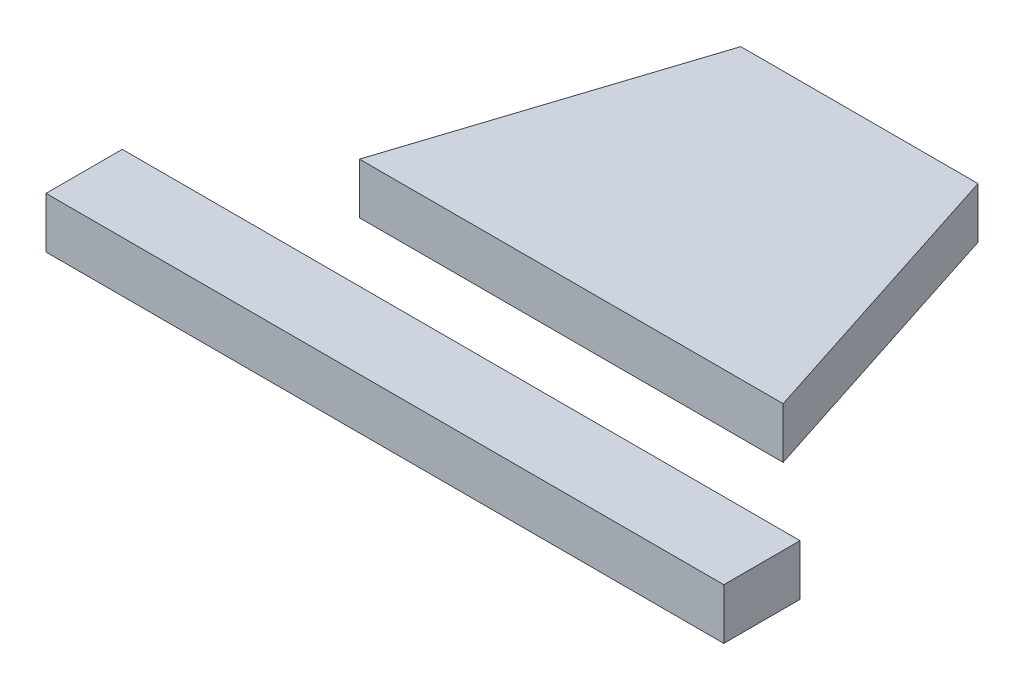
ISO-10303-21;
HEADER;
FILE_DESCRIPTION(('STEP AP214'),'2;1');
FILE_NAME('part.step','',(''),(''),'','','');
FILE_SCHEMA(('AUTOMOTIVE_DESIGN { 1 0 10303 214 1 1 1 1 }'));
ENDSEC;
DATA;
#1=APPLICATION_CONTEXT('core data for automotive mechanical design processes');
#2=APPLICATION_PROTOCOL_DEFINITION('international standard','automotive_design',2000,#1);
#3=PRODUCT_CONTEXT('',#1,'mechanical');
#4=PRODUCT('Part','Part','',(#3));
#5=PRODUCT_RELATED_PRODUCT_CATEGORY('part','',(#4));
#6=PRODUCT_DEFINITION_FORMATION('','',#4);
#7=PRODUCT_DEFINITION_CONTEXT('part definition',#1,'design');
#8=PRODUCT_DEFINITION('design','',#6,#7);
#9=PRODUCT_DEFINITION_SHAPE('','',#8);
#10=(LENGTH_UNIT() NAMED_UNIT(*) SI_UNIT(.MILLI.,.METRE.));
#11=(NAMED_UNIT(*) PLANE_ANGLE_UNIT() SI_UNIT($,.RADIAN.));
#12=(NAMED_UNIT(*) SI_UNIT($,.STERADIAN.) SOLID_ANGLE_UNIT());
#13=UNCERTAINTY_MEASURE_WITH_UNIT(LENGTH_MEASURE(1.E-05),#10,'distance_accuracy_value','');
#14=(GEOMETRIC_REPRESENTATION_CONTEXT(3) GLOBAL_UNCERTAINTY_ASSIGNED_CONTEXT((#13)) GLOBAL_UNIT_ASSIGNED_CONTEXT((#10,
#11,#12)) REPRESENTATION_CONTEXT('',''));
#15=CARTESIAN_POINT('',(0.,0.,0.));
#16=DIRECTION('',(0.,0.,1.));
#17=DIRECTION('',(1.,0.,0.));
#18=AXIS2_PLACEMENT_3D('',#15,#16,#17);
#19=CARTESIAN_POINT('',(-7.,3.,-25.75));
#20=DIRECTION('',(0.,0.,-1.));
#21=DIRECTION('',(-1.,0.,0.));
#22=AXIS2_PLACEMENT_3D('',#19,#20,#21);
#23=PLANE('',#22);
#24=DIRECTION('',(1.,0.,0.));
#25=VECTOR('',#24,1.);
#26=CARTESIAN_POINT('',(-7.,0.,-25.75));
#27=LINE('',#26,#25);
#28=CARTESIAN_POINT('',(-7.,0.,-25.75));
#29=VERTEX_POINT('',#28);
#30=CARTESIAN_POINT('',(7.,0.,-25.75));
#31=VERTEX_POINT('',#30);
#32=EDGE_CURVE('E12',#29,#31,#27,.T.);
#33=ORIENTED_EDGE('',*,*,#32,.F.);
#34=DIRECTION('',(0.,-1.,0.));
#35=VECTOR('',#34,1.);
#36=CARTESIAN_POINT('',(-7.,3.,-25.75));
#37=LINE('',#36,#35);
#38=CARTESIAN_POINT('',(-7.,3.,-25.75));
#39=VERTEX_POINT('',#38);
#40=EDGE_CURVE('E91',#39,#29,#37,.T.);
#41=ORIENTED_EDGE('',*,*,#40,.F.);
#42=DIRECTION('',(1.,0.,0.));
#43=VECTOR('',#42,1.);
#44=CARTESIAN_POINT('',(-7.,3.,-25.75));
#45=LINE('',#44,#43);
#46=CARTESIAN_POINT('',(7.,3.,-25.75));
#47=VERTEX_POINT('',#46);
#48=EDGE_CURVE('E49',#39,#47,#45,.T.);
#49=ORIENTED_EDGE('',*,*,#48,.T.);
#50=DIRECTION('',(0.,-1.,0.));
#51=VECTOR('',#50,1.);
#52=CARTESIAN_POINT('',(7.,3.,-25.75));
#53=LINE('',#52,#51);
#54=EDGE_CURVE('E64',#47,#31,#53,.T.);
#55=ORIENTED_EDGE('',*,*,#54,.T.);
#56=EDGE_LOOP('',(#33,#41,#49,#55));
#57=FACE_BOUND('',#56,.T.);
#58=ADVANCED_FACE('F45',(#57),#23,.T.);
#59=CARTESIAN_POINT('',(-7.,3.,-25.75));
#60=DIRECTION('',(0.951444518554411,0.,0.307820285414663));
#61=DIRECTION('',(0.307820285414663,0.,-0.951444518554412));
#62=AXIS2_PLACEMENT_3D('',#59,#60,#61);
#63=PLANE('',#62);
#64=DIRECTION('',(-0.307820285414663,0.,0.951444518554411));
#65=VECTOR('',#64,1.);
#66=CARTESIAN_POINT('',(-7.,0.,-25.75));
#67=LINE('',#66,#65);
#68=CARTESIAN_POINT('',(-12.5,0.,-8.75));
#69=VERTEX_POINT('',#68);
#70=EDGE_CURVE('E94',#29,#69,#67,.T.);
#71=ORIENTED_EDGE('',*,*,#70,.T.);
#72=DIRECTION('',(0.,-1.,0.));
#73=VECTOR('',#72,1.);
#74=CARTESIAN_POINT('',(-12.5,3.,-8.75));
#75=LINE('',#74,#73);
#76=CARTESIAN_POINT('',(-12.5,3.,-8.75));
#77=VERTEX_POINT('',#76);
#78=EDGE_CURVE('E97',#77,#69,#75,.T.);
#79=ORIENTED_EDGE('',*,*,#78,.F.);
#80=DIRECTION('',(-0.307820285414663,0.,0.951444518554411));
#81=VECTOR('',#80,1.);
#82=CARTESIAN_POINT('',(-7.,3.,-25.75));
#83=LINE('',#82,#81);
#84=EDGE_CURVE('E113',#39,#77,#83,.T.);
#85=ORIENTED_EDGE('',*,*,#84,.F.);
#86=ORIENTED_EDGE('',*,*,#40,.T.);
#87=EDGE_LOOP('',(#71,#79,#85,#86));
#88=FACE_BOUND('',#87,.T.);
#89=ADVANCED_FACE('F96',(#88),#63,.F.);
#90=CARTESIAN_POINT('',(-12.5,3.,-8.75));
#91=DIRECTION('',(0.,0.,-1.));
#92=DIRECTION('',(-1.,0.,0.));
#93=AXIS2_PLACEMENT_3D('',#90,#91,#92);
#94=PLANE('',#93);
#95=DIRECTION('',(1.,0.,0.));
#96=VECTOR('',#95,1.);
#97=CARTESIAN_POINT('',(-12.5,0.,-8.75));
#98=LINE('',#97,#96);
#99=CARTESIAN_POINT('',(12.5,0.,-8.75));
#100=VERTEX_POINT('',#99);
#101=EDGE_CURVE('E100',#69,#100,#98,.T.);
#102=ORIENTED_EDGE('',*,*,#101,.T.);
#103=DIRECTION('',(0.,-1.,0.));
#104=VECTOR('',#103,1.);
#105=CARTESIAN_POINT('',(12.5,3.,-8.75));
#106=LINE('',#105,#104);
#107=CARTESIAN_POINT('',(12.5,3.,-8.75));
#108=VERTEX_POINT('',#107);
#109=EDGE_CURVE('E106',#108,#100,#106,.T.);
#110=ORIENTED_EDGE('',*,*,#109,.F.);
#111=DIRECTION('',(1.,0.,0.));
#112=VECTOR('',#111,1.);
#113=CARTESIAN_POINT('',(-12.5,3.,-8.75));
#114=LINE('',#113,#112);
#115=EDGE_CURVE('E81',#77,#108,#114,.T.);
#116=ORIENTED_EDGE('',*,*,#115,.F.);
#117=ORIENTED_EDGE('',*,*,#78,.T.);
#118=EDGE_LOOP('',(#102,#110,#116,#117));
#119=FACE_BOUND('',#118,.T.);
#120=ADVANCED_FACE('F104',(#119),#94,.F.);
#121=CARTESIAN_POINT('',(7.,3.,-25.75));
#122=DIRECTION('',(0.951444518554411,0.,-0.307820285414663));
#123=DIRECTION('',(-0.307820285414663,0.,-0.951444518554412));
#124=AXIS2_PLACEMENT_3D('',#121,#122,#123);
#125=PLANE('',#124);
#126=DIRECTION('',(0.307820285414663,0.,0.951444518554411));
#127=VECTOR('',#126,1.);
#128=CARTESIAN_POINT('',(7.,0.,-25.75));
#129=LINE('',#128,#127);
#130=EDGE_CURVE('E55',#31,#100,#129,.T.);
#131=ORIENTED_EDGE('',*,*,#130,.F.);
#132=ORIENTED_EDGE('',*,*,#54,.F.);
#133=DIRECTION('',(0.307820285414663,0.,0.951444518554411));
#134=VECTOR('',#133,1.);
#135=CARTESIAN_POINT('',(7.,3.,-25.75));
#136=LINE('',#135,#134);
#137=EDGE_CURVE('E115',#47,#108,#136,.T.);
#138=ORIENTED_EDGE('',*,*,#137,.T.);
#139=ORIENTED_EDGE('',*,*,#109,.T.);
#140=EDGE_LOOP('',(#131,#132,#138,#139));
#141=FACE_BOUND('',#140,.T.);
#142=ADVANCED_FACE('F118',(#141),#125,.T.);
#143=CARTESIAN_POINT('',(0.,3.,0.));
#144=DIRECTION('',(0.,-1.,0.));
#145=DIRECTION('',(0.,0.,-1.));
#146=AXIS2_PLACEMENT_3D('',#143,#144,#145);
#147=PLANE('',#146);
#148=ORIENTED_EDGE('',*,*,#48,.F.);
#149=ORIENTED_EDGE('',*,*,#84,.T.);
#150=ORIENTED_EDGE('',*,*,#115,.T.);
#151=ORIENTED_EDGE('',*,*,#137,.F.);
#152=EDGE_LOOP('',(#148,#149,#150,#151));
#153=FACE_BOUND('',#152,.T.);
#154=ADVANCED_FACE('F47',(#153),#147,.F.);
#155=CARTESIAN_POINT('',(0.,0.,0.));
#156=DIRECTION('',(0.,-1.,0.));
#157=DIRECTION('',(0.,0.,-1.));
#158=AXIS2_PLACEMENT_3D('',#155,#156,#157);
#159=PLANE('',#158);
#160=ORIENTED_EDGE('',*,*,#32,.T.);
#161=ORIENTED_EDGE('',*,*,#130,.T.);
#162=ORIENTED_EDGE('',*,*,#101,.F.);
#163=ORIENTED_EDGE('',*,*,#70,.F.);
#164=EDGE_LOOP('',(#160,#161,#162,#163));
#165=FACE_BOUND('',#164,.T.);
#166=ADVANCED_FACE('F108',(#165),#159,.T.);
#167=CLOSED_SHELL('',(#58,#89,#120,#142,#154,#166));
#168=MANIFOLD_SOLID_BREP('B2',#167);
#169=CARTESIAN_POINT('',(20.,3.,0.));
#170=DIRECTION('',(1.,0.,0.));
#171=DIRECTION('',(0.,0.,-1.));
#172=AXIS2_PLACEMENT_3D('',#169,#170,#171);
#173=PLANE('',#172);
#174=DIRECTION('',(0.,0.,1.));
#175=VECTOR('',#174,1.);
#176=CARTESIAN_POINT('',(20.,0.,0.));
#177=LINE('',#176,#175);
#178=CARTESIAN_POINT('',(20.,0.,-2.25));
#179=VERTEX_POINT('',#178);
#180=CARTESIAN_POINT('',(20.,0.,2.25));
#181=VERTEX_POINT('',#180);
#182=EDGE_CURVE('E232',#179,#181,#177,.T.);
#183=ORIENTED_EDGE('',*,*,#182,.F.);
#184=DIRECTION('',(0.,-1.,0.));
#185=VECTOR('',#184,1.);
#186=CARTESIAN_POINT('',(20.,3.,-2.25));
#187=LINE('',#186,#185);
#188=CARTESIAN_POINT('',(20.,3.,-2.25));
#189=VERTEX_POINT('',#188);
#190=EDGE_CURVE('E43',#189,#179,#187,.T.);
#191=ORIENTED_EDGE('',*,*,#190,.F.);
#192=DIRECTION('',(0.,0.,1.));
#193=VECTOR('',#192,1.);
#194=CARTESIAN_POINT('',(20.,3.,0.));
#195=LINE('',#194,#193);
#196=CARTESIAN_POINT('',(20.,3.,2.25));
#197=VERTEX_POINT('',#196);
#198=EDGE_CURVE('E226',#189,#197,#195,.T.);
#199=ORIENTED_EDGE('',*,*,#198,.T.);
#200=DIRECTION('',(0.,-1.,0.));
#201=VECTOR('',#200,1.);
#202=CARTESIAN_POINT('',(20.,3.,2.25));
#203=LINE('',#202,#201);
#204=EDGE_CURVE('E207',#197,#181,#203,.T.);
#205=ORIENTED_EDGE('',*,*,#204,.T.);
#206=EDGE_LOOP('',(#183,#191,#199,#205));
#207=FACE_BOUND('',#206,.T.);
#208=ADVANCED_FACE('F169',(#207),#173,.T.);
#209=CARTESIAN_POINT('',(0.,3.,-2.25));
#210=DIRECTION('',(0.,0.,-1.));
#211=DIRECTION('',(-1.,0.,0.));
#212=AXIS2_PLACEMENT_3D('',#209,#210,#211);
#213=PLANE('',#212);
#214=DIRECTION('',(1.,0.,0.));
#215=VECTOR('',#214,1.);
#216=CARTESIAN_POINT('',(0.,0.,-2.25));
#217=LINE('',#216,#215);
#218=CARTESIAN_POINT('',(-20.,0.,-2.25));
#219=VERTEX_POINT('',#218);
#220=EDGE_CURVE('E220',#219,#179,#217,.T.);
#221=ORIENTED_EDGE('',*,*,#220,.F.);
#222=DIRECTION('',(0.,-1.,0.));
#223=VECTOR('',#222,1.);
#224=CARTESIAN_POINT('',(-20.,3.,-2.25));
#225=LINE('',#224,#223);
#226=CARTESIAN_POINT('',(-20.,3.,-2.25));
#227=VERTEX_POINT('',#226);
#228=EDGE_CURVE('E177',#227,#219,#225,.T.);
#229=ORIENTED_EDGE('',*,*,#228,.F.);
#230=DIRECTION('',(1.,0.,0.));
#231=VECTOR('',#230,1.);
#232=CARTESIAN_POINT('',(0.,3.,-2.25));
#233=LINE('',#232,#231);
#234=EDGE_CURVE('E218',#227,#189,#233,.T.);
#235=ORIENTED_EDGE('',*,*,#234,.T.);
#236=ORIENTED_EDGE('',*,*,#190,.T.);
#237=EDGE_LOOP('',(#221,#229,#235,#236));
#238=FACE_BOUND('',#237,.T.);
#239=ADVANCED_FACE('F216',(#238),#213,.T.);
#240=CARTESIAN_POINT('',(-20.,3.,0.));
#241=DIRECTION('',(1.,0.,0.));
#242=DIRECTION('',(0.,0.,-1.));
#243=AXIS2_PLACEMENT_3D('',#240,#241,#242);
#244=PLANE('',#243);
#245=DIRECTION('',(0.,0.,1.));
#246=VECTOR('',#245,1.);
#247=CARTESIAN_POINT('',(-20.,0.,0.));
#248=LINE('',#247,#246);
#249=CARTESIAN_POINT('',(-20.,0.,2.25));
#250=VERTEX_POINT('',#249);
#251=EDGE_CURVE('E200',#219,#250,#248,.T.);
#252=ORIENTED_EDGE('',*,*,#251,.T.);
#253=DIRECTION('',(0.,-1.,0.));
#254=VECTOR('',#253,1.);
#255=CARTESIAN_POINT('',(-20.,3.,2.25));
#256=LINE('',#255,#254);
#257=CARTESIAN_POINT('',(-20.,3.,2.25));
#258=VERTEX_POINT('',#257);
#259=EDGE_CURVE('E221',#258,#250,#256,.T.);
#260=ORIENTED_EDGE('',*,*,#259,.F.);
#261=DIRECTION('',(0.,0.,1.));
#262=VECTOR('',#261,1.);
#263=CARTESIAN_POINT('',(-20.,3.,0.));
#264=LINE('',#263,#262);
#265=EDGE_CURVE('E222',#227,#258,#264,.T.);
#266=ORIENTED_EDGE('',*,*,#265,.F.);
#267=ORIENTED_EDGE('',*,*,#228,.T.);
#268=EDGE_LOOP('',(#252,#260,#266,#267));
#269=FACE_BOUND('',#268,.T.);
#270=ADVANCED_FACE('F223',(#269),#244,.F.);
#271=CARTESIAN_POINT('',(0.,3.,2.25));
#272=DIRECTION('',(0.,0.,-1.));
#273=DIRECTION('',(-1.,0.,0.));
#274=AXIS2_PLACEMENT_3D('',#271,#272,#273);
#275=PLANE('',#274);
#276=DIRECTION('',(1.,0.,0.));
#277=VECTOR('',#276,1.);
#278=CARTESIAN_POINT('',(0.,0.,2.25));
#279=LINE('',#278,#277);
#280=EDGE_CURVE('E228',#250,#181,#279,.T.);
#281=ORIENTED_EDGE('',*,*,#280,.T.);
#282=ORIENTED_EDGE('',*,*,#204,.F.);
#283=DIRECTION('',(1.,0.,0.));
#284=VECTOR('',#283,1.);
#285=CARTESIAN_POINT('',(0.,3.,2.25));
#286=LINE('',#285,#284);
#287=EDGE_CURVE('E185',#258,#197,#286,.T.);
#288=ORIENTED_EDGE('',*,*,#287,.F.);
#289=ORIENTED_EDGE('',*,*,#259,.T.);
#290=EDGE_LOOP('',(#281,#282,#288,#289));
#291=FACE_BOUND('',#290,.T.);
#292=ADVANCED_FACE('F241',(#291),#275,.F.);
#293=CARTESIAN_POINT('',(0.,3.,0.));
#294=DIRECTION('',(0.,1.,0.));
#295=DIRECTION('',(0.,0.,1.));
#296=AXIS2_PLACEMENT_3D('',#293,#294,#295);
#297=PLANE('',#296);
#298=ORIENTED_EDGE('',*,*,#198,.F.);
#299=ORIENTED_EDGE('',*,*,#234,.F.);
#300=ORIENTED_EDGE('',*,*,#265,.T.);
#301=ORIENTED_EDGE('',*,*,#287,.T.);
#302=EDGE_LOOP('',(#298,#299,#300,#301));
#303=FACE_BOUND('',#302,.T.);
#304=ADVANCED_FACE('F225',(#303),#297,.T.);
#305=CARTESIAN_POINT('',(0.,0.,0.));
#306=DIRECTION('',(0.,1.,0.));
#307=DIRECTION('',(0.,0.,1.));
#308=AXIS2_PLACEMENT_3D('',#305,#306,#307);
#309=PLANE('',#308);
#310=ORIENTED_EDGE('',*,*,#182,.T.);
#311=ORIENTED_EDGE('',*,*,#280,.F.);
#312=ORIENTED_EDGE('',*,*,#251,.F.);
#313=ORIENTED_EDGE('',*,*,#220,.T.);
#314=EDGE_LOOP('',(#310,#311,#312,#313));
#315=FACE_BOUND('',#314,.T.);
#316=ADVANCED_FACE('F243',(#315),#309,.F.);
#317=CLOSED_SHELL('',(#208,#239,#270,#292,#304,#316));
#318=MANIFOLD_SOLID_BREP('B6',#317);
#319=ADVANCED_BREP_SHAPE_REPRESENTATION('',(#18,#168,#318),#14);
#320=SHAPE_DEFINITION_REPRESENTATION(#9,#319);
ENDSEC;
END-ISO-10303-21;
